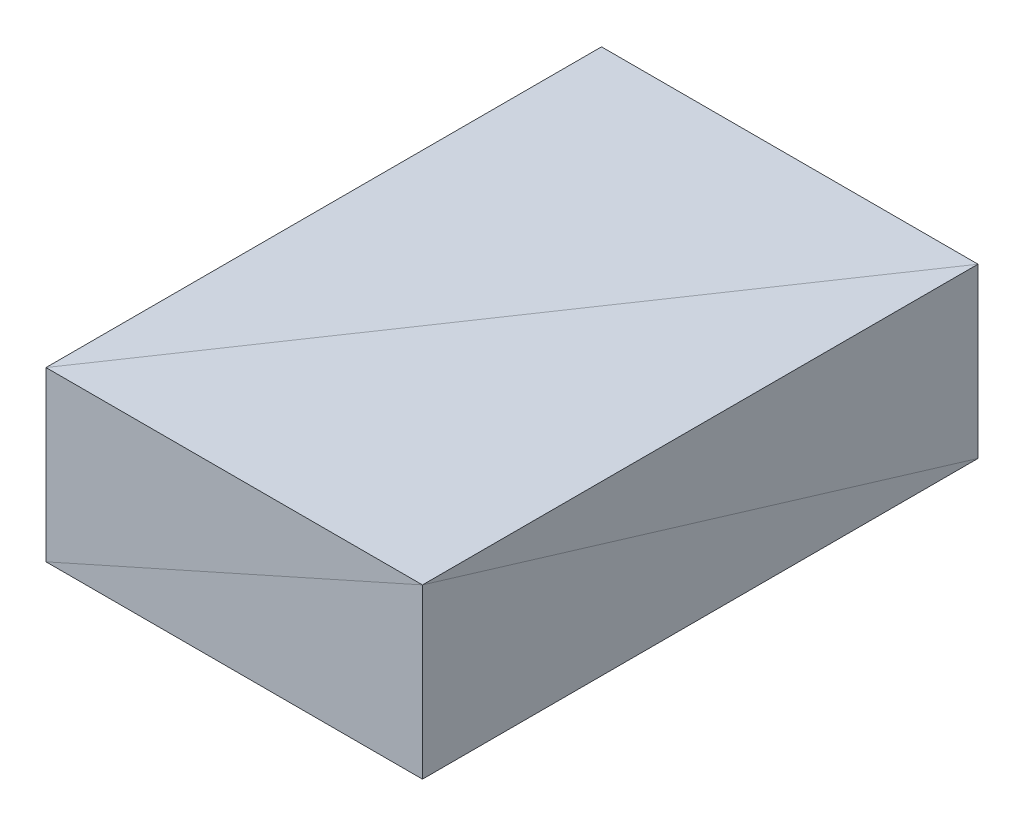
ISO-10303-21;
HEADER;
FILE_DESCRIPTION(('STEP AP214'),'2;1');
FILE_NAME('part.step','',(''),(''),'','','');
FILE_SCHEMA(('AUTOMOTIVE_DESIGN { 1 0 10303 214 1 1 1 1 }'));
ENDSEC;
DATA;
#1=APPLICATION_CONTEXT('core data for automotive mechanical design processes');
#2=APPLICATION_PROTOCOL_DEFINITION('international standard','automotive_design',2000,#1);
#3=PRODUCT_CONTEXT('',#1,'mechanical');
#4=PRODUCT('Part','Part','',(#3));
#5=PRODUCT_RELATED_PRODUCT_CATEGORY('part','',(#4));
#6=PRODUCT_DEFINITION_FORMATION('','',#4);
#7=PRODUCT_DEFINITION_CONTEXT('part definition',#1,'design');
#8=PRODUCT_DEFINITION('design','',#6,#7);
#9=PRODUCT_DEFINITION_SHAPE('','',#8);
#10=(LENGTH_UNIT() NAMED_UNIT(*) SI_UNIT(.MILLI.,.METRE.));
#11=(NAMED_UNIT(*) PLANE_ANGLE_UNIT() SI_UNIT($,.RADIAN.));
#12=(NAMED_UNIT(*) SI_UNIT($,.STERADIAN.) SOLID_ANGLE_UNIT());
#13=UNCERTAINTY_MEASURE_WITH_UNIT(LENGTH_MEASURE(1.E-05),#10,'distance_accuracy_value','');
#14=(GEOMETRIC_REPRESENTATION_CONTEXT(3) GLOBAL_UNCERTAINTY_ASSIGNED_CONTEXT((#13)) GLOBAL_UNIT_ASSIGNED_CONTEXT((#10,
#11,#12)) REPRESENTATION_CONTEXT('',''));
#15=CARTESIAN_POINT('',(0.,0.,0.));
#16=DIRECTION('',(0.,0.,1.));
#17=DIRECTION('',(1.,0.,0.));
#18=AXIS2_PLACEMENT_3D('',#15,#16,#17);
#19=CARTESIAN_POINT('',(-2.965000152588,-1.535999933879,8.751000086466));
#20=DIRECTION('',(0.,0.,-1.));
#21=DIRECTION('',(0.,-1.,0.));
#22=AXIS2_PLACEMENT_3D('',#19,#20,#21);
#23=PLANE('',#22);
#24=CARTESIAN_POINT('',(2.965000152588,1.114000002543,8.751000086466));
#25=DIRECTION('',(-1.,0.,0.));
#26=VECTOR('',#25,1.);
#27=LINE('',#24,#26);
#28=CARTESIAN_POINT('',(2.96500015258807,1.11400000254285,8.751000086466));
#29=VERTEX_POINT('',#28);
#30=CARTESIAN_POINT('',(-2.96500015258832,1.114000002543,8.75100008646578));
#31=VERTEX_POINT('',#30);
#32=EDGE_CURVE('E61',#29,#31,#27,.T.);
#33=ORIENTED_EDGE('',*,*,#32,.T.);
#34=CARTESIAN_POINT('',(-2.965000152588,1.114000002543,8.751000086466));
#35=DIRECTION('',(0.,-1.,0.));
#36=VECTOR('',#35,1.);
#37=LINE('',#34,#36);
#38=CARTESIAN_POINT('',(-2.96500015258807,-1.53599993387885,8.751000086466));
#39=VERTEX_POINT('',#38);
#40=EDGE_CURVE('E65',#31,#39,#37,.T.);
#41=ORIENTED_EDGE('',*,*,#40,.T.);
#42=CARTESIAN_POINT('',(-2.965000152588,-1.535999933879,8.751000086466));
#43=DIRECTION('',(0.912984319201983,0.407994648115992,0.));
#44=VECTOR('',#43,1.);
#45=LINE('',#42,#44);
#46=EDGE_CURVE('E58',#39,#29,#45,.T.);
#47=ORIENTED_EDGE('',*,*,#46,.T.);
#48=EDGE_LOOP('',(#33,#41,#47));
#49=FACE_BOUND('',#48,.T.);
#50=ADVANCED_FACE('F16',(#49),#23,.F.);
#51=CARTESIAN_POINT('',(-2.965000152588,-1.535999933879,8.751000086466));
#52=DIRECTION('',(0.,0.,-1.));
#53=DIRECTION('',(0.,-1.,0.));
#54=AXIS2_PLACEMENT_3D('',#51,#52,#53);
#55=PLANE('',#54);
#56=CARTESIAN_POINT('',(2.965000152588,-1.535999933879,8.751000086466));
#57=DIRECTION('',(0.,1.,0.));
#58=VECTOR('',#57,1.);
#59=LINE('',#56,#58);
#60=CARTESIAN_POINT('',(2.96500015258832,-1.535999933879,8.75100008646578));
#61=VERTEX_POINT('',#60);
#62=EDGE_CURVE('E71',#61,#29,#59,.T.);
#63=ORIENTED_EDGE('',*,*,#62,.T.);
#64=ORIENTED_EDGE('',*,*,#46,.F.);
#65=CARTESIAN_POINT('',(-2.965000152588,-1.535999933879,8.751000086466));
#66=DIRECTION('',(1.,0.,0.));
#67=VECTOR('',#66,1.);
#68=LINE('',#65,#67);
#69=EDGE_CURVE('E77',#39,#61,#68,.T.);
#70=ORIENTED_EDGE('',*,*,#69,.T.);
#71=EDGE_LOOP('',(#63,#64,#70));
#72=FACE_BOUND('',#71,.T.);
#73=ADVANCED_FACE('F76',(#72),#55,.F.);
#74=CARTESIAN_POINT('',(2.965000152588,-1.535999933879,8.751000086466));
#75=DIRECTION('',(-1.,0.,0.));
#76=DIRECTION('',(0.,0.,1.));
#77=AXIS2_PLACEMENT_3D('',#74,#75,#76);
#78=PLANE('',#77);
#79=CARTESIAN_POINT('',(2.965000152588,-1.535999933879,0.0010000000086885));
#80=DIRECTION('',(0.,0.289855594475072,0.957070391534239));
#81=VECTOR('',#80,1.);
#82=LINE('',#79,#81);
#83=CARTESIAN_POINT('',(2.965000152588,-1.53599993387899,0.00100000000868808));
#84=VERTEX_POINT('',#83);
#85=EDGE_CURVE('E86',#84,#29,#82,.T.);
#86=ORIENTED_EDGE('',*,*,#85,.T.);
#87=ORIENTED_EDGE('',*,*,#62,.F.);
#88=CARTESIAN_POINT('',(2.965000152588,-1.535999933879,8.751000086466));
#89=DIRECTION('',(0.,0.,-1.));
#90=VECTOR('',#89,1.);
#91=LINE('',#88,#90);
#92=EDGE_CURVE('E89',#61,#84,#91,.T.);
#93=ORIENTED_EDGE('',*,*,#92,.T.);
#94=EDGE_LOOP('',(#86,#87,#93));
#95=FACE_BOUND('',#94,.T.);
#96=ADVANCED_FACE('F88',(#95),#78,.F.);
#97=CARTESIAN_POINT('',(2.965000152588,1.114000002543,8.751000086466));
#98=DIRECTION('',(0.,-1.,0.));
#99=DIRECTION('',(0.,0.,-1.));
#100=AXIS2_PLACEMENT_3D('',#97,#98,#99);
#101=PLANE('',#100);
#102=CARTESIAN_POINT('',(2.965000152588,1.114000002543,0.0010000000086885));
#103=DIRECTION('',(-0.561015498967797,0.,0.827805297106701));
#104=VECTOR('',#103,1.);
#105=LINE('',#102,#104);
#106=CARTESIAN_POINT('',(2.96500015258832,1.11400000254286,0.0010000000088639));
#107=VERTEX_POINT('',#106);
#108=EDGE_CURVE('E105',#107,#31,#105,.T.);
#109=ORIENTED_EDGE('',*,*,#108,.T.);
#110=ORIENTED_EDGE('',*,*,#32,.F.);
#111=CARTESIAN_POINT('',(2.965000152588,1.114000002543,8.751000086466));
#112=DIRECTION('',(0.,0.,-1.));
#113=VECTOR('',#112,1.);
#114=LINE('',#111,#113);
#115=EDGE_CURVE('E97',#29,#107,#114,.T.);
#116=ORIENTED_EDGE('',*,*,#115,.T.);
#117=EDGE_LOOP('',(#109,#110,#116));
#118=FACE_BOUND('',#117,.T.);
#119=ADVANCED_FACE('F102',(#118),#101,.F.);
#120=CARTESIAN_POINT('',(-2.965000152588,1.114000002543,8.751000086466));
#121=DIRECTION('',(1.,0.,0.));
#122=DIRECTION('',(0.,1.,0.));
#123=AXIS2_PLACEMENT_3D('',#120,#121,#122);
#124=PLANE('',#123);
#125=CARTESIAN_POINT('',(-2.965000152588,1.114000002543,0.0010000000086885));
#126=DIRECTION('',(0.,-0.289855594475072,0.957070391534239));
#127=VECTOR('',#126,1.);
#128=LINE('',#125,#127);
#129=CARTESIAN_POINT('',(-2.965000152588,1.11400000254299,0.00100000000868808));
#130=VERTEX_POINT('',#129);
#131=EDGE_CURVE('E214',#130,#39,#128,.T.);
#132=ORIENTED_EDGE('',*,*,#131,.T.);
#133=ORIENTED_EDGE('',*,*,#40,.F.);
#134=CARTESIAN_POINT('',(-2.965000152588,1.114000002543,8.751000086466));
#135=DIRECTION('',(0.,0.,-1.));
#136=VECTOR('',#135,1.);
#137=LINE('',#134,#136);
#138=EDGE_CURVE('E204',#31,#130,#137,.T.);
#139=ORIENTED_EDGE('',*,*,#138,.T.);
#140=EDGE_LOOP('',(#132,#133,#139));
#141=FACE_BOUND('',#140,.T.);
#142=ADVANCED_FACE('F183',(#141),#124,.F.);
#143=CARTESIAN_POINT('',(-2.965000152588,-1.535999933879,8.751000086466));
#144=DIRECTION('',(0.,1.,0.));
#145=DIRECTION('',(1.,0.,0.));
#146=AXIS2_PLACEMENT_3D('',#143,#144,#145);
#147=PLANE('',#146);
#148=CARTESIAN_POINT('',(-2.965000152588,-1.535999933879,0.0010000000086885));
#149=DIRECTION('',(0.561015498967797,0.,0.827805297106701));
#150=VECTOR('',#149,1.);
#151=LINE('',#148,#150);
#152=CARTESIAN_POINT('',(-2.96500015258832,-1.53599993387886,0.0010000000088639));
#153=VERTEX_POINT('',#152);
#154=EDGE_CURVE('E116',#153,#61,#151,.T.);
#155=ORIENTED_EDGE('',*,*,#154,.T.);
#156=ORIENTED_EDGE('',*,*,#69,.F.);
#157=CARTESIAN_POINT('',(-2.965000152588,-1.535999933879,8.751000086466));
#158=DIRECTION('',(0.,0.,-1.));
#159=VECTOR('',#158,1.);
#160=LINE('',#157,#159);
#161=EDGE_CURVE('E36',#39,#153,#160,.T.);
#162=ORIENTED_EDGE('',*,*,#161,.T.);
#163=EDGE_LOOP('',(#155,#156,#162));
#164=FACE_BOUND('',#163,.T.);
#165=ADVANCED_FACE('F135',(#164),#147,.F.);
#166=CARTESIAN_POINT('',(2.965000152588,-1.535999933879,0.001000000008692));
#167=DIRECTION('',(-1.,0.,0.));
#168=DIRECTION('',(0.,0.,1.));
#169=AXIS2_PLACEMENT_3D('',#166,#167,#168);
#170=PLANE('',#169);
#171=ORIENTED_EDGE('',*,*,#115,.F.);
#172=ORIENTED_EDGE('',*,*,#85,.F.);
#173=CARTESIAN_POINT('',(2.965000152588,-1.535999933879,0.001000000008692));
#174=DIRECTION('',(0.,1.,0.));
#175=VECTOR('',#174,1.);
#176=LINE('',#173,#175);
#177=EDGE_CURVE('E113',#84,#107,#176,.T.);
#178=ORIENTED_EDGE('',*,*,#177,.T.);
#179=EDGE_LOOP('',(#171,#172,#178));
#180=FACE_BOUND('',#179,.T.);
#181=ADVANCED_FACE('F111',(#180),#170,.F.);
#182=CARTESIAN_POINT('',(-2.965000152588,-1.535999933879,0.001000000008692));
#183=DIRECTION('',(0.,1.,0.));
#184=DIRECTION('',(1.,0.,0.));
#185=AXIS2_PLACEMENT_3D('',#182,#183,#184);
#186=PLANE('',#185);
#187=ORIENTED_EDGE('',*,*,#92,.F.);
#188=ORIENTED_EDGE('',*,*,#154,.F.);
#189=CARTESIAN_POINT('',(-2.965000152588,-1.535999933879,0.001000000008692));
#190=DIRECTION('',(1.,0.,0.));
#191=VECTOR('',#190,1.);
#192=LINE('',#189,#191);
#193=EDGE_CURVE('E228',#153,#84,#192,.T.);
#194=ORIENTED_EDGE('',*,*,#193,.T.);
#195=EDGE_LOOP('',(#187,#188,#194));
#196=FACE_BOUND('',#195,.T.);
#197=ADVANCED_FACE('F134',(#196),#186,.F.);
#198=CARTESIAN_POINT('',(2.965000152588,1.114000002543,0.001000000008692));
#199=DIRECTION('',(0.,-1.,0.));
#200=DIRECTION('',(0.,0.,-1.));
#201=AXIS2_PLACEMENT_3D('',#198,#199,#200);
#202=PLANE('',#201);
#203=ORIENTED_EDGE('',*,*,#138,.F.);
#204=ORIENTED_EDGE('',*,*,#108,.F.);
#205=CARTESIAN_POINT('',(2.965000152588,1.114000002543,0.001000000008692));
#206=DIRECTION('',(-1.,0.,0.));
#207=VECTOR('',#206,1.);
#208=LINE('',#205,#207);
#209=EDGE_CURVE('E219',#107,#130,#208,.T.);
#210=ORIENTED_EDGE('',*,*,#209,.T.);
#211=EDGE_LOOP('',(#203,#204,#210));
#212=FACE_BOUND('',#211,.T.);
#213=ADVANCED_FACE('F221',(#212),#202,.F.);
#214=CARTESIAN_POINT('',(-2.965000152588,1.114000002543,0.001000000008692));
#215=DIRECTION('',(1.,0.,0.));
#216=DIRECTION('',(0.,1.,0.));
#217=AXIS2_PLACEMENT_3D('',#214,#215,#216);
#218=PLANE('',#217);
#219=ORIENTED_EDGE('',*,*,#161,.F.);
#220=ORIENTED_EDGE('',*,*,#131,.F.);
#221=CARTESIAN_POINT('',(-2.965000152588,1.114000002543,0.001000000008692));
#222=DIRECTION('',(0.,-1.,0.));
#223=VECTOR('',#222,1.);
#224=LINE('',#221,#223);
#225=EDGE_CURVE('E28',#130,#153,#224,.T.);
#226=ORIENTED_EDGE('',*,*,#225,.T.);
#227=EDGE_LOOP('',(#219,#220,#226));
#228=FACE_BOUND('',#227,.T.);
#229=ADVANCED_FACE('F234',(#228),#218,.F.);
#230=CARTESIAN_POINT('',(2.965000152588,-1.535999933879,0.001000000008692));
#231=DIRECTION('',(0.,0.,1.));
#232=DIRECTION('',(1.,0.,0.));
#233=AXIS2_PLACEMENT_3D('',#230,#231,#232);
#234=PLANE('',#233);
#235=CARTESIAN_POINT('',(-2.965000152588,-1.535999933879,0.001000000008692));
#236=DIRECTION('',(0.912984319201983,0.407994648115992,0.));
#237=VECTOR('',#236,1.);
#238=LINE('',#235,#237);
#239=EDGE_CURVE('E11',#153,#107,#238,.T.);
#240=ORIENTED_EDGE('',*,*,#239,.T.);
#241=ORIENTED_EDGE('',*,*,#177,.F.);
#242=ORIENTED_EDGE('',*,*,#193,.F.);
#243=EDGE_LOOP('',(#240,#241,#242));
#244=FACE_BOUND('',#243,.T.);
#245=ADVANCED_FACE('F261',(#244),#234,.F.);
#246=CARTESIAN_POINT('',(2.965000152588,1.114000002543,0.001000000008692));
#247=DIRECTION('',(0.,0.,1.));
#248=DIRECTION('',(1.,0.,0.));
#249=AXIS2_PLACEMENT_3D('',#246,#247,#248);
#250=PLANE('',#249);
#251=ORIENTED_EDGE('',*,*,#225,.F.);
#252=ORIENTED_EDGE('',*,*,#209,.F.);
#253=ORIENTED_EDGE('',*,*,#239,.F.);
#254=EDGE_LOOP('',(#251,#252,#253));
#255=FACE_BOUND('',#254,.T.);
#256=ADVANCED_FACE('F242',(#255),#250,.F.);
#257=CLOSED_SHELL('',(#50,#73,#96,#119,#142,#165,#181,#197,#213,#229,#245,#256));
#258=MANIFOLD_SOLID_BREP('B1',#257);
#259=ADVANCED_BREP_SHAPE_REPRESENTATION('',(#18,#258),#14);
#260=SHAPE_DEFINITION_REPRESENTATION(#9,#259);
ENDSEC;
END-ISO-10303-21;
